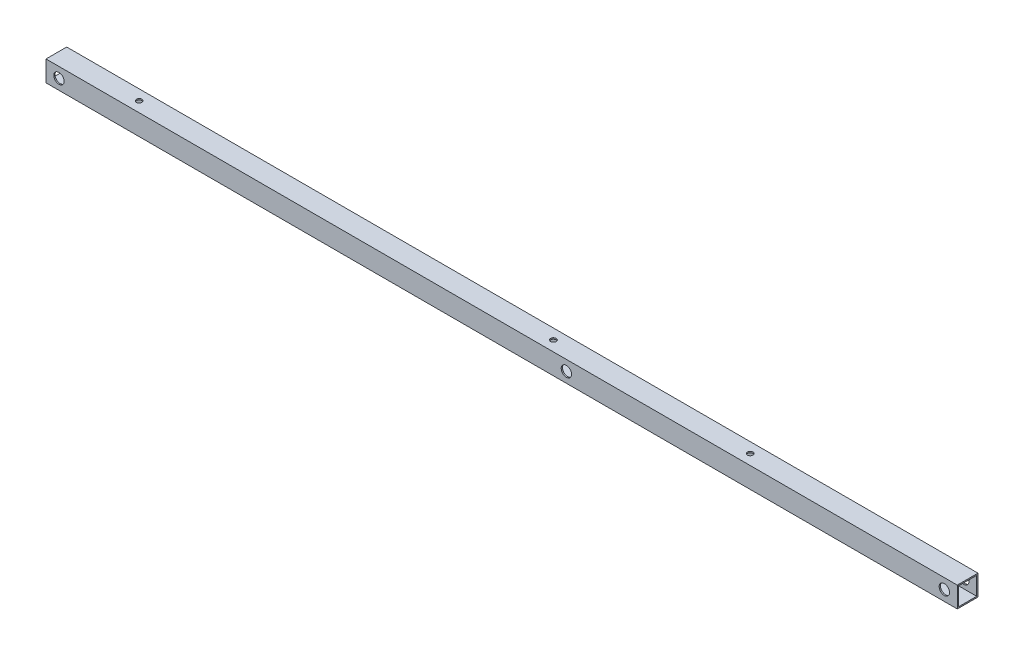
ISO-10303-21;
HEADER;
FILE_DESCRIPTION(('STEP AP214'),'2;1');
FILE_NAME('part.step','',(''),(''),'','','');
FILE_SCHEMA(('AUTOMOTIVE_DESIGN { 1 0 10303 214 1 1 1 1 }'));
ENDSEC;
DATA;
#1=APPLICATION_CONTEXT('core data for automotive mechanical design processes');
#2=APPLICATION_PROTOCOL_DEFINITION('international standard','automotive_design',2000,#1);
#3=PRODUCT_CONTEXT('',#1,'mechanical');
#4=PRODUCT('Part','Part','',(#3));
#5=PRODUCT_RELATED_PRODUCT_CATEGORY('part','',(#4));
#6=PRODUCT_DEFINITION_FORMATION('','',#4);
#7=PRODUCT_DEFINITION_CONTEXT('part definition',#1,'design');
#8=PRODUCT_DEFINITION('design','',#6,#7);
#9=PRODUCT_DEFINITION_SHAPE('','',#8);
#10=(LENGTH_UNIT() NAMED_UNIT(*) SI_UNIT(.MILLI.,.METRE.));
#11=(NAMED_UNIT(*) PLANE_ANGLE_UNIT() SI_UNIT($,.RADIAN.));
#12=(NAMED_UNIT(*) SI_UNIT($,.STERADIAN.) SOLID_ANGLE_UNIT());
#13=UNCERTAINTY_MEASURE_WITH_UNIT(LENGTH_MEASURE(1.E-05),#10,'distance_accuracy_value','');
#14=(GEOMETRIC_REPRESENTATION_CONTEXT(3) GLOBAL_UNCERTAINTY_ASSIGNED_CONTEXT((#13)) GLOBAL_UNIT_ASSIGNED_CONTEXT((#10,
#11,#12)) REPRESENTATION_CONTEXT('',''));
#15=CARTESIAN_POINT('',(0.,0.,0.));
#16=DIRECTION('',(0.,0.,1.));
#17=DIRECTION('',(1.,0.,0.));
#18=AXIS2_PLACEMENT_3D('',#15,#16,#17);
#19=CARTESIAN_POINT('',(558.8,12.7,12.7));
#20=DIRECTION('',(0.,-1.,0.));
#21=DIRECTION('',(0.,0.,-1.));
#22=AXIS2_PLACEMENT_3D('',#19,#20,#21);
#23=PLANE('',#22);
#24=CARTESIAN_POINT('',(-457.2,12.7,0.));
#25=DIRECTION('',(0.,1.,0.));
#26=DIRECTION('',(0.,0.,1.));
#27=AXIS2_PLACEMENT_3D('',#24,#25,#26);
#28=CIRCLE('',#27,3.3782);
#29=CARTESIAN_POINT('',(-457.2,12.7,3.3782));
#30=VERTEX_POINT('',#29);
#31=EDGE_CURVE('E361',#30,#30,#28,.T.);
#32=ORIENTED_EDGE('',*,*,#31,.F.);
#33=EDGE_LOOP('',(#32));
#34=FACE_BOUND('',#33,.T.);
#35=CARTESIAN_POINT('',(292.1,12.7,0.));
#36=DIRECTION('',(0.,1.,0.));
#37=DIRECTION('',(0.,0.,1.));
#38=AXIS2_PLACEMENT_3D('',#35,#36,#37);
#39=CIRCLE('',#38,3.3782);
#40=CARTESIAN_POINT('',(292.1,12.7,3.3782));
#41=VERTEX_POINT('',#40);
#42=EDGE_CURVE('E231',#41,#41,#39,.T.);
#43=ORIENTED_EDGE('',*,*,#42,.F.);
#44=EDGE_LOOP('',(#43));
#45=FACE_BOUND('',#44,.T.);
#46=DIRECTION('',(0.,0.,1.));
#47=VECTOR('',#46,1.);
#48=CARTESIAN_POINT('',(-558.8,12.7,12.7));
#49=LINE('',#48,#47);
#50=CARTESIAN_POINT('',(-558.8,12.7,-12.7));
#51=VERTEX_POINT('',#50);
#52=CARTESIAN_POINT('',(-558.8,12.7,12.7));
#53=VERTEX_POINT('',#52);
#54=EDGE_CURVE('E177',#51,#53,#49,.T.);
#55=ORIENTED_EDGE('',*,*,#54,.T.);
#56=DIRECTION('',(-1.,0.,0.));
#57=VECTOR('',#56,1.);
#58=CARTESIAN_POINT('',(558.8,12.7,12.7));
#59=LINE('',#58,#57);
#60=CARTESIAN_POINT('',(558.8,12.7,12.7));
#61=VERTEX_POINT('',#60);
#62=EDGE_CURVE('E68',#61,#53,#59,.T.);
#63=ORIENTED_EDGE('',*,*,#62,.F.);
#64=DIRECTION('',(0.,0.,1.));
#65=VECTOR('',#64,1.);
#66=CARTESIAN_POINT('',(558.8,12.7,12.7));
#67=LINE('',#66,#65);
#68=CARTESIAN_POINT('',(558.8,12.7,-12.7));
#69=VERTEX_POINT('',#68);
#70=EDGE_CURVE('E167',#69,#61,#67,.T.);
#71=ORIENTED_EDGE('',*,*,#70,.F.);
#72=DIRECTION('',(-1.,0.,0.));
#73=VECTOR('',#72,1.);
#74=CARTESIAN_POINT('',(558.8,12.7,-12.7));
#75=LINE('',#74,#73);
#76=EDGE_CURVE('E12',#69,#51,#75,.T.);
#77=ORIENTED_EDGE('',*,*,#76,.T.);
#78=EDGE_LOOP('',(#55,#63,#71,#77));
#79=FACE_BOUND('',#78,.T.);
#80=CARTESIAN_POINT('',(50.8,12.7,0.));
#81=DIRECTION('',(0.,1.,0.));
#82=DIRECTION('',(0.,0.,1.));
#83=AXIS2_PLACEMENT_3D('',#80,#81,#82);
#84=CIRCLE('',#83,3.3782);
#85=CARTESIAN_POINT('',(50.8,12.7,3.3782));
#86=VERTEX_POINT('',#85);
#87=EDGE_CURVE('E213',#86,#86,#84,.T.);
#88=ORIENTED_EDGE('',*,*,#87,.F.);
#89=EDGE_LOOP('',(#88));
#90=FACE_BOUND('',#89,.T.);
#91=ADVANCED_FACE('F59',(#34,#45,#79,#90),#23,.F.);
#92=CARTESIAN_POINT('',(558.8,0.,0.));
#93=DIRECTION('',(1.,0.,0.));
#94=DIRECTION('',(0.,0.,-1.));
#95=AXIS2_PLACEMENT_3D('',#92,#93,#94);
#96=PLANE('',#95);
#97=DIRECTION('',(0.,1.,0.));
#98=VECTOR('',#97,1.);
#99=CARTESIAN_POINT('',(558.8,-12.7,-12.7));
#100=LINE('',#99,#98);
#101=CARTESIAN_POINT('',(558.8,-12.7,-12.7));
#102=VERTEX_POINT('',#101);
#103=EDGE_CURVE('E164',#102,#69,#100,.T.);
#104=ORIENTED_EDGE('',*,*,#103,.T.);
#105=ORIENTED_EDGE('',*,*,#70,.T.);
#106=DIRECTION('',(0.,-1.,0.));
#107=VECTOR('',#106,1.);
#108=CARTESIAN_POINT('',(558.8,-12.7,12.7));
#109=LINE('',#108,#107);
#110=CARTESIAN_POINT('',(558.8,-12.7,12.7));
#111=VERTEX_POINT('',#110);
#112=EDGE_CURVE('E170',#61,#111,#109,.T.);
#113=ORIENTED_EDGE('',*,*,#112,.T.);
#114=DIRECTION('',(0.,0.,-1.));
#115=VECTOR('',#114,1.);
#116=CARTESIAN_POINT('',(558.8,-12.7,12.7));
#117=LINE('',#116,#115);
#118=EDGE_CURVE('E172',#111,#102,#117,.T.);
#119=ORIENTED_EDGE('',*,*,#118,.T.);
#120=EDGE_LOOP('',(#104,#105,#113,#119));
#121=FACE_BOUND('',#120,.T.);
#122=DIRECTION('',(0.,0.,1.));
#123=VECTOR('',#122,1.);
#124=CARTESIAN_POINT('',(558.8,11.1125,0.));
#125=LINE('',#124,#123);
#126=CARTESIAN_POINT('',(558.8,11.1125,-11.1125));
#127=VERTEX_POINT('',#126);
#128=CARTESIAN_POINT('',(558.8,11.1125,11.1125));
#129=VERTEX_POINT('',#128);
#130=EDGE_CURVE('E133',#127,#129,#125,.T.);
#131=ORIENTED_EDGE('',*,*,#130,.F.);
#132=DIRECTION('',(0.,1.,0.));
#133=VECTOR('',#132,1.);
#134=CARTESIAN_POINT('',(558.8,0.,-11.1125));
#135=LINE('',#134,#133);
#136=CARTESIAN_POINT('',(558.8,-11.1125,-11.1125));
#137=VERTEX_POINT('',#136);
#138=EDGE_CURVE('E125',#137,#127,#135,.T.);
#139=ORIENTED_EDGE('',*,*,#138,.F.);
#140=DIRECTION('',(0.,0.,-1.));
#141=VECTOR('',#140,1.);
#142=CARTESIAN_POINT('',(558.8,-11.1125,0.));
#143=LINE('',#142,#141);
#144=CARTESIAN_POINT('',(558.8,-11.1125,11.1125));
#145=VERTEX_POINT('',#144);
#146=EDGE_CURVE('E148',#145,#137,#143,.T.);
#147=ORIENTED_EDGE('',*,*,#146,.F.);
#148=DIRECTION('',(0.,-1.,0.));
#149=VECTOR('',#148,1.);
#150=CARTESIAN_POINT('',(558.8,0.,11.1125));
#151=LINE('',#150,#149);
#152=EDGE_CURVE('E146',#129,#145,#151,.T.);
#153=ORIENTED_EDGE('',*,*,#152,.F.);
#154=EDGE_LOOP('',(#131,#139,#147,#153));
#155=FACE_BOUND('',#154,.T.);
#156=ADVANCED_FACE('F145',(#121,#155),#96,.T.);
#157=CARTESIAN_POINT('',(-558.8,0.,0.));
#158=DIRECTION('',(1.,0.,0.));
#159=DIRECTION('',(0.,0.,-1.));
#160=AXIS2_PLACEMENT_3D('',#157,#158,#159);
#161=PLANE('',#160);
#162=DIRECTION('',(0.,1.,0.));
#163=VECTOR('',#162,1.);
#164=CARTESIAN_POINT('',(-558.8,-12.7,-12.7));
#165=LINE('',#164,#163);
#166=CARTESIAN_POINT('',(-558.8,-12.7,-12.7));
#167=VERTEX_POINT('',#166);
#168=EDGE_CURVE('E141',#167,#51,#165,.T.);
#169=ORIENTED_EDGE('',*,*,#168,.F.);
#170=DIRECTION('',(0.,0.,-1.));
#171=VECTOR('',#170,1.);
#172=CARTESIAN_POINT('',(-558.8,-12.7,12.7));
#173=LINE('',#172,#171);
#174=CARTESIAN_POINT('',(-558.8,-12.7,12.7));
#175=VERTEX_POINT('',#174);
#176=EDGE_CURVE('E168',#175,#167,#173,.T.);
#177=ORIENTED_EDGE('',*,*,#176,.F.);
#178=DIRECTION('',(0.,-1.,0.));
#179=VECTOR('',#178,1.);
#180=CARTESIAN_POINT('',(-558.8,-12.7,12.7));
#181=LINE('',#180,#179);
#182=EDGE_CURVE('E179',#53,#175,#181,.T.);
#183=ORIENTED_EDGE('',*,*,#182,.F.);
#184=ORIENTED_EDGE('',*,*,#54,.F.);
#185=EDGE_LOOP('',(#169,#177,#183,#184));
#186=FACE_BOUND('',#185,.T.);
#187=DIRECTION('',(0.,1.,0.));
#188=VECTOR('',#187,1.);
#189=CARTESIAN_POINT('',(-558.8,0.,-11.1125));
#190=LINE('',#189,#188);
#191=CARTESIAN_POINT('',(-558.8,-11.1125,-11.1125));
#192=VERTEX_POINT('',#191);
#193=CARTESIAN_POINT('',(-558.8,11.1125,-11.1125));
#194=VERTEX_POINT('',#193);
#195=EDGE_CURVE('E83',#192,#194,#190,.T.);
#196=ORIENTED_EDGE('',*,*,#195,.T.);
#197=DIRECTION('',(0.,0.,1.));
#198=VECTOR('',#197,1.);
#199=CARTESIAN_POINT('',(-558.8,11.1125,0.));
#200=LINE('',#199,#198);
#201=CARTESIAN_POINT('',(-558.8,11.1125,11.1125));
#202=VERTEX_POINT('',#201);
#203=EDGE_CURVE('E140',#194,#202,#200,.T.);
#204=ORIENTED_EDGE('',*,*,#203,.T.);
#205=DIRECTION('',(0.,-1.,0.));
#206=VECTOR('',#205,1.);
#207=CARTESIAN_POINT('',(-558.8,0.,11.1125));
#208=LINE('',#207,#206);
#209=CARTESIAN_POINT('',(-558.8,-11.1125,11.1125));
#210=VERTEX_POINT('',#209);
#211=EDGE_CURVE('E156',#202,#210,#208,.T.);
#212=ORIENTED_EDGE('',*,*,#211,.T.);
#213=DIRECTION('',(0.,0.,-1.));
#214=VECTOR('',#213,1.);
#215=CARTESIAN_POINT('',(-558.8,-11.1125,0.));
#216=LINE('',#215,#214);
#217=EDGE_CURVE('E134',#210,#192,#216,.T.);
#218=ORIENTED_EDGE('',*,*,#217,.T.);
#219=EDGE_LOOP('',(#196,#204,#212,#218));
#220=FACE_BOUND('',#219,.T.);
#221=ADVANCED_FACE('F198',(#186,#220),#161,.F.);
#222=CARTESIAN_POINT('',(558.8,-12.7,-12.7));
#223=DIRECTION('',(0.,0.,1.));
#224=DIRECTION('',(1.,0.,0.));
#225=AXIS2_PLACEMENT_3D('',#222,#223,#224);
#226=PLANE('',#225);
#227=CARTESIAN_POINT('',(-542.925,0.,-12.7));
#228=DIRECTION('',(0.,0.,1.));
#229=DIRECTION('',(1.,0.,0.));
#230=AXIS2_PLACEMENT_3D('',#227,#228,#229);
#231=CIRCLE('',#230,6.34999999999997);
#232=CARTESIAN_POINT('',(-536.575,0.,-12.7));
#233=VERTEX_POINT('',#232);
#234=EDGE_CURVE('E246',#233,#233,#231,.T.);
#235=ORIENTED_EDGE('',*,*,#234,.T.);
#236=EDGE_LOOP('',(#235));
#237=FACE_BOUND('',#236,.T.);
#238=CARTESIAN_POINT('',(542.925,0.,-12.7));
#239=DIRECTION('',(0.,0.,1.));
#240=DIRECTION('',(1.,0.,0.));
#241=AXIS2_PLACEMENT_3D('',#238,#239,#240);
#242=CIRCLE('',#241,6.34999999999997);
#243=CARTESIAN_POINT('',(549.275,0.,-12.7));
#244=VERTEX_POINT('',#243);
#245=EDGE_CURVE('E255',#244,#244,#242,.T.);
#246=ORIENTED_EDGE('',*,*,#245,.T.);
#247=EDGE_LOOP('',(#246));
#248=FACE_BOUND('',#247,.T.);
#249=CARTESIAN_POINT('',(79.375,0.,-12.7));
#250=DIRECTION('',(0.,0.,1.));
#251=DIRECTION('',(1.,0.,0.));
#252=AXIS2_PLACEMENT_3D('',#249,#250,#251);
#253=CIRCLE('',#252,6.34999999999999);
#254=CARTESIAN_POINT('',(85.725,0.,-12.7));
#255=VERTEX_POINT('',#254);
#256=EDGE_CURVE('E267',#255,#255,#253,.T.);
#257=ORIENTED_EDGE('',*,*,#256,.T.);
#258=EDGE_LOOP('',(#257));
#259=FACE_BOUND('',#258,.T.);
#260=ORIENTED_EDGE('',*,*,#168,.T.);
#261=ORIENTED_EDGE('',*,*,#76,.F.);
#262=ORIENTED_EDGE('',*,*,#103,.F.);
#263=DIRECTION('',(-1.,0.,0.));
#264=VECTOR('',#263,1.);
#265=CARTESIAN_POINT('',(558.8,-12.7,-12.7));
#266=LINE('',#265,#264);
#267=EDGE_CURVE('E174',#102,#167,#266,.T.);
#268=ORIENTED_EDGE('',*,*,#267,.T.);
#269=EDGE_LOOP('',(#260,#261,#262,#268));
#270=FACE_BOUND('',#269,.T.);
#271=ADVANCED_FACE('F61',(#237,#248,#259,#270),#226,.F.);
#272=CARTESIAN_POINT('',(558.8,-12.7,12.7));
#273=DIRECTION('',(0.,0.,-1.));
#274=DIRECTION('',(-1.,0.,0.));
#275=AXIS2_PLACEMENT_3D('',#272,#273,#274);
#276=PLANE('',#275);
#277=CARTESIAN_POINT('',(-542.925,0.,12.7));
#278=DIRECTION('',(0.,0.,1.));
#279=DIRECTION('',(1.,0.,0.));
#280=AXIS2_PLACEMENT_3D('',#277,#278,#279);
#281=CIRCLE('',#280,6.34999999999997);
#282=CARTESIAN_POINT('',(-536.575,0.,12.7));
#283=VERTEX_POINT('',#282);
#284=EDGE_CURVE('E243',#283,#283,#281,.T.);
#285=ORIENTED_EDGE('',*,*,#284,.F.);
#286=EDGE_LOOP('',(#285));
#287=FACE_BOUND('',#286,.T.);
#288=CARTESIAN_POINT('',(542.925,0.,12.7));
#289=DIRECTION('',(0.,0.,1.));
#290=DIRECTION('',(1.,0.,0.));
#291=AXIS2_PLACEMENT_3D('',#288,#289,#290);
#292=CIRCLE('',#291,6.34999999999997);
#293=CARTESIAN_POINT('',(549.275,0.,12.7));
#294=VERTEX_POINT('',#293);
#295=EDGE_CURVE('E252',#294,#294,#292,.T.);
#296=ORIENTED_EDGE('',*,*,#295,.F.);
#297=EDGE_LOOP('',(#296));
#298=FACE_BOUND('',#297,.T.);
#299=CARTESIAN_POINT('',(79.375,0.,12.7));
#300=DIRECTION('',(0.,0.,1.));
#301=DIRECTION('',(1.,0.,0.));
#302=AXIS2_PLACEMENT_3D('',#299,#300,#301);
#303=CIRCLE('',#302,6.34999999999999);
#304=CARTESIAN_POINT('',(85.725,0.,12.7));
#305=VERTEX_POINT('',#304);
#306=EDGE_CURVE('E264',#305,#305,#303,.T.);
#307=ORIENTED_EDGE('',*,*,#306,.F.);
#308=EDGE_LOOP('',(#307));
#309=FACE_BOUND('',#308,.T.);
#310=ORIENTED_EDGE('',*,*,#182,.T.);
#311=DIRECTION('',(-1.,0.,0.));
#312=VECTOR('',#311,1.);
#313=CARTESIAN_POINT('',(558.8,-12.7,12.7));
#314=LINE('',#313,#312);
#315=EDGE_CURVE('E184',#111,#175,#314,.T.);
#316=ORIENTED_EDGE('',*,*,#315,.F.);
#317=ORIENTED_EDGE('',*,*,#112,.F.);
#318=ORIENTED_EDGE('',*,*,#62,.T.);
#319=EDGE_LOOP('',(#310,#316,#317,#318));
#320=FACE_BOUND('',#319,.T.);
#321=ADVANCED_FACE('F192',(#287,#298,#309,#320),#276,.F.);
#322=CARTESIAN_POINT('',(558.8,-12.7,12.7));
#323=DIRECTION('',(0.,1.,0.));
#324=DIRECTION('',(0.,0.,1.));
#325=AXIS2_PLACEMENT_3D('',#322,#323,#324);
#326=PLANE('',#325);
#327=CARTESIAN_POINT('',(-457.2,-12.7,0.));
#328=DIRECTION('',(0.,1.,0.));
#329=DIRECTION('',(0.,0.,1.));
#330=AXIS2_PLACEMENT_3D('',#327,#328,#329);
#331=CIRCLE('',#330,3.3782);
#332=CARTESIAN_POINT('',(-457.2,-12.7,3.3782));
#333=VERTEX_POINT('',#332);
#334=EDGE_CURVE('E362',#333,#333,#331,.T.);
#335=ORIENTED_EDGE('',*,*,#334,.T.);
#336=EDGE_LOOP('',(#335));
#337=FACE_BOUND('',#336,.T.);
#338=CARTESIAN_POINT('',(50.8,-12.7,0.));
#339=DIRECTION('',(0.,1.,0.));
#340=DIRECTION('',(0.,0.,1.));
#341=AXIS2_PLACEMENT_3D('',#338,#339,#340);
#342=CIRCLE('',#341,3.37819999999999);
#343=CARTESIAN_POINT('',(50.8,-12.7,3.37819999999999));
#344=VERTEX_POINT('',#343);
#345=EDGE_CURVE('E215',#344,#344,#342,.T.);
#346=ORIENTED_EDGE('',*,*,#345,.T.);
#347=EDGE_LOOP('',(#346));
#348=FACE_BOUND('',#347,.T.);
#349=CARTESIAN_POINT('',(292.1,-12.7,0.));
#350=DIRECTION('',(0.,1.,0.));
#351=DIRECTION('',(0.,0.,1.));
#352=AXIS2_PLACEMENT_3D('',#349,#350,#351);
#353=CIRCLE('',#352,3.3782);
#354=CARTESIAN_POINT('',(292.1,-12.7,3.3782));
#355=VERTEX_POINT('',#354);
#356=EDGE_CURVE('E234',#355,#355,#353,.T.);
#357=ORIENTED_EDGE('',*,*,#356,.T.);
#358=EDGE_LOOP('',(#357));
#359=FACE_BOUND('',#358,.T.);
#360=ORIENTED_EDGE('',*,*,#176,.T.);
#361=ORIENTED_EDGE('',*,*,#267,.F.);
#362=ORIENTED_EDGE('',*,*,#118,.F.);
#363=ORIENTED_EDGE('',*,*,#315,.T.);
#364=EDGE_LOOP('',(#360,#361,#362,#363));
#365=FACE_BOUND('',#364,.T.);
#366=ADVANCED_FACE('F202',(#337,#348,#359,#365),#326,.F.);
#367=CARTESIAN_POINT('',(558.8,0.,-11.1125));
#368=DIRECTION('',(0.,0.,1.));
#369=DIRECTION('',(1.,0.,0.));
#370=AXIS2_PLACEMENT_3D('',#367,#368,#369);
#371=PLANE('',#370);
#372=CARTESIAN_POINT('',(-542.925,0.,-11.1125));
#373=DIRECTION('',(0.,0.,1.));
#374=DIRECTION('',(1.,0.,0.));
#375=AXIS2_PLACEMENT_3D('',#372,#373,#374);
#376=CIRCLE('',#375,6.34999999999997);
#377=CARTESIAN_POINT('',(-536.575,0.,-11.1125));
#378=VERTEX_POINT('',#377);
#379=EDGE_CURVE('E249',#378,#378,#376,.T.);
#380=ORIENTED_EDGE('',*,*,#379,.F.);
#381=EDGE_LOOP('',(#380));
#382=FACE_BOUND('',#381,.T.);
#383=CARTESIAN_POINT('',(542.925,0.,-11.1125));
#384=DIRECTION('',(0.,0.,1.));
#385=DIRECTION('',(1.,0.,0.));
#386=AXIS2_PLACEMENT_3D('',#383,#384,#385);
#387=CIRCLE('',#386,6.34999999999997);
#388=CARTESIAN_POINT('',(549.275,0.,-11.1125));
#389=VERTEX_POINT('',#388);
#390=EDGE_CURVE('E258',#389,#389,#387,.T.);
#391=ORIENTED_EDGE('',*,*,#390,.F.);
#392=EDGE_LOOP('',(#391));
#393=FACE_BOUND('',#392,.T.);
#394=CARTESIAN_POINT('',(79.375,0.,-11.1125));
#395=DIRECTION('',(0.,0.,1.));
#396=DIRECTION('',(1.,0.,0.));
#397=AXIS2_PLACEMENT_3D('',#394,#395,#396);
#398=CIRCLE('',#397,6.34999999999999);
#399=CARTESIAN_POINT('',(85.725,0.,-11.1125));
#400=VERTEX_POINT('',#399);
#401=EDGE_CURVE('E270',#400,#400,#398,.T.);
#402=ORIENTED_EDGE('',*,*,#401,.F.);
#403=EDGE_LOOP('',(#402));
#404=FACE_BOUND('',#403,.T.);
#405=ORIENTED_EDGE('',*,*,#195,.F.);
#406=DIRECTION('',(-1.,0.,0.));
#407=VECTOR('',#406,1.);
#408=CARTESIAN_POINT('',(558.8,-11.1125,-11.1125));
#409=LINE('',#408,#407);
#410=EDGE_CURVE('E129',#137,#192,#409,.T.);
#411=ORIENTED_EDGE('',*,*,#410,.F.);
#412=ORIENTED_EDGE('',*,*,#138,.T.);
#413=DIRECTION('',(-1.,0.,0.));
#414=VECTOR('',#413,1.);
#415=CARTESIAN_POINT('',(558.8,11.1125,-11.1125));
#416=LINE('',#415,#414);
#417=EDGE_CURVE('E128',#127,#194,#416,.T.);
#418=ORIENTED_EDGE('',*,*,#417,.T.);
#419=EDGE_LOOP('',(#405,#411,#412,#418));
#420=FACE_BOUND('',#419,.T.);
#421=ADVANCED_FACE('F127',(#382,#393,#404,#420),#371,.T.);
#422=CARTESIAN_POINT('',(558.8,11.1125,0.));
#423=DIRECTION('',(0.,-1.,0.));
#424=DIRECTION('',(0.,0.,-1.));
#425=AXIS2_PLACEMENT_3D('',#422,#423,#424);
#426=PLANE('',#425);
#427=CARTESIAN_POINT('',(-457.2,11.1125,0.));
#428=DIRECTION('',(0.,-1.,0.));
#429=DIRECTION('',(0.,0.,-1.));
#430=AXIS2_PLACEMENT_3D('',#427,#428,#429);
#431=CIRCLE('',#430,3.3782);
#432=CARTESIAN_POINT('',(-457.2,11.1125,-3.3782));
#433=VERTEX_POINT('',#432);
#434=EDGE_CURVE('E222',#433,#433,#431,.T.);
#435=ORIENTED_EDGE('',*,*,#434,.F.);
#436=EDGE_LOOP('',(#435));
#437=FACE_BOUND('',#436,.T.);
#438=CARTESIAN_POINT('',(50.8,11.1125,0.));
#439=DIRECTION('',(0.,-1.,0.));
#440=DIRECTION('',(0.,0.,-1.));
#441=AXIS2_PLACEMENT_3D('',#438,#439,#440);
#442=CIRCLE('',#441,3.37819999999999);
#443=CARTESIAN_POINT('',(50.8,11.1125,-3.3782));
#444=VERTEX_POINT('',#443);
#445=EDGE_CURVE('E219',#444,#444,#442,.T.);
#446=ORIENTED_EDGE('',*,*,#445,.F.);
#447=EDGE_LOOP('',(#446));
#448=FACE_BOUND('',#447,.T.);
#449=CARTESIAN_POINT('',(292.1,11.1125,0.));
#450=DIRECTION('',(0.,-1.,0.));
#451=DIRECTION('',(0.,0.,-1.));
#452=AXIS2_PLACEMENT_3D('',#449,#450,#451);
#453=CIRCLE('',#452,3.3782);
#454=CARTESIAN_POINT('',(292.1,11.1125,-3.3782));
#455=VERTEX_POINT('',#454);
#456=EDGE_CURVE('E240',#455,#455,#453,.T.);
#457=ORIENTED_EDGE('',*,*,#456,.F.);
#458=EDGE_LOOP('',(#457));
#459=FACE_BOUND('',#458,.T.);
#460=ORIENTED_EDGE('',*,*,#203,.F.);
#461=ORIENTED_EDGE('',*,*,#417,.F.);
#462=ORIENTED_EDGE('',*,*,#130,.T.);
#463=DIRECTION('',(-1.,0.,0.));
#464=VECTOR('',#463,1.);
#465=CARTESIAN_POINT('',(558.8,11.1125,11.1125));
#466=LINE('',#465,#464);
#467=EDGE_CURVE('E142',#129,#202,#466,.T.);
#468=ORIENTED_EDGE('',*,*,#467,.T.);
#469=EDGE_LOOP('',(#460,#461,#462,#468));
#470=FACE_BOUND('',#469,.T.);
#471=ADVANCED_FACE('F137',(#437,#448,#459,#470),#426,.T.);
#472=CARTESIAN_POINT('',(558.8,0.,11.1125));
#473=DIRECTION('',(0.,0.,-1.));
#474=DIRECTION('',(-1.,0.,0.));
#475=AXIS2_PLACEMENT_3D('',#472,#473,#474);
#476=PLANE('',#475);
#477=CARTESIAN_POINT('',(-542.925,0.,11.1125));
#478=DIRECTION('',(0.,0.,-1.));
#479=DIRECTION('',(-1.,0.,0.));
#480=AXIS2_PLACEMENT_3D('',#477,#478,#479);
#481=CIRCLE('',#480,6.34999999999997);
#482=CARTESIAN_POINT('',(-549.275,0.,11.1125));
#483=VERTEX_POINT('',#482);
#484=EDGE_CURVE('E63',#483,#483,#481,.T.);
#485=ORIENTED_EDGE('',*,*,#484,.F.);
#486=EDGE_LOOP('',(#485));
#487=FACE_BOUND('',#486,.T.);
#488=CARTESIAN_POINT('',(542.925,0.,11.1125));
#489=DIRECTION('',(0.,0.,-1.));
#490=DIRECTION('',(-1.,0.,0.));
#491=AXIS2_PLACEMENT_3D('',#488,#489,#490);
#492=CIRCLE('',#491,6.34999999999997);
#493=CARTESIAN_POINT('',(536.575,0.,11.1125));
#494=VERTEX_POINT('',#493);
#495=EDGE_CURVE('E261',#494,#494,#492,.T.);
#496=ORIENTED_EDGE('',*,*,#495,.F.);
#497=EDGE_LOOP('',(#496));
#498=FACE_BOUND('',#497,.T.);
#499=CARTESIAN_POINT('',(79.375,0.,11.1125));
#500=DIRECTION('',(0.,0.,-1.));
#501=DIRECTION('',(-1.,0.,0.));
#502=AXIS2_PLACEMENT_3D('',#499,#500,#501);
#503=CIRCLE('',#502,6.34999999999999);
#504=CARTESIAN_POINT('',(73.025,0.,11.1125));
#505=VERTEX_POINT('',#504);
#506=EDGE_CURVE('E154',#505,#505,#503,.T.);
#507=ORIENTED_EDGE('',*,*,#506,.F.);
#508=EDGE_LOOP('',(#507));
#509=FACE_BOUND('',#508,.T.);
#510=ORIENTED_EDGE('',*,*,#211,.F.);
#511=ORIENTED_EDGE('',*,*,#467,.F.);
#512=ORIENTED_EDGE('',*,*,#152,.T.);
#513=DIRECTION('',(-1.,0.,0.));
#514=VECTOR('',#513,1.);
#515=CARTESIAN_POINT('',(558.8,-11.1125,11.1125));
#516=LINE('',#515,#514);
#517=EDGE_CURVE('E75',#145,#210,#516,.T.);
#518=ORIENTED_EDGE('',*,*,#517,.T.);
#519=EDGE_LOOP('',(#510,#511,#512,#518));
#520=FACE_BOUND('',#519,.T.);
#521=ADVANCED_FACE('F278',(#487,#498,#509,#520),#476,.T.);
#522=CARTESIAN_POINT('',(558.8,-11.1125,0.));
#523=DIRECTION('',(0.,1.,0.));
#524=DIRECTION('',(0.,0.,1.));
#525=AXIS2_PLACEMENT_3D('',#522,#523,#524);
#526=PLANE('',#525);
#527=CARTESIAN_POINT('',(-457.2,-11.1125,0.));
#528=DIRECTION('',(0.,1.,0.));
#529=DIRECTION('',(0.,0.,1.));
#530=AXIS2_PLACEMENT_3D('',#527,#528,#529);
#531=CIRCLE('',#530,3.3782);
#532=CARTESIAN_POINT('',(-457.2,-11.1125,3.3782));
#533=VERTEX_POINT('',#532);
#534=EDGE_CURVE('E216',#533,#533,#531,.T.);
#535=ORIENTED_EDGE('',*,*,#534,.F.);
#536=EDGE_LOOP('',(#535));
#537=FACE_BOUND('',#536,.T.);
#538=CARTESIAN_POINT('',(50.8,-11.1125,0.));
#539=DIRECTION('',(0.,1.,0.));
#540=DIRECTION('',(0.,0.,1.));
#541=AXIS2_PLACEMENT_3D('',#538,#539,#540);
#542=CIRCLE('',#541,3.37819999999999);
#543=CARTESIAN_POINT('',(50.8,-11.1125,3.3782));
#544=VERTEX_POINT('',#543);
#545=EDGE_CURVE('E228',#544,#544,#542,.T.);
#546=ORIENTED_EDGE('',*,*,#545,.F.);
#547=EDGE_LOOP('',(#546));
#548=FACE_BOUND('',#547,.T.);
#549=CARTESIAN_POINT('',(292.1,-11.1125,0.));
#550=DIRECTION('',(0.,1.,0.));
#551=DIRECTION('',(0.,0.,1.));
#552=AXIS2_PLACEMENT_3D('',#549,#550,#551);
#553=CIRCLE('',#552,3.3782);
#554=CARTESIAN_POINT('',(292.1,-11.1125,3.3782));
#555=VERTEX_POINT('',#554);
#556=EDGE_CURVE('E237',#555,#555,#553,.T.);
#557=ORIENTED_EDGE('',*,*,#556,.F.);
#558=EDGE_LOOP('',(#557));
#559=FACE_BOUND('',#558,.T.);
#560=ORIENTED_EDGE('',*,*,#217,.F.);
#561=ORIENTED_EDGE('',*,*,#517,.F.);
#562=ORIENTED_EDGE('',*,*,#146,.T.);
#563=ORIENTED_EDGE('',*,*,#410,.T.);
#564=EDGE_LOOP('',(#560,#561,#562,#563));
#565=FACE_BOUND('',#564,.T.);
#566=ADVANCED_FACE('F281',(#537,#548,#559,#565),#526,.T.);
#567=CARTESIAN_POINT('',(79.375,0.,12.7));
#568=DIRECTION('',(0.,0.,1.));
#569=DIRECTION('',(1.,0.,0.));
#570=AXIS2_PLACEMENT_3D('',#567,#568,#569);
#571=CYLINDRICAL_SURFACE('',#570,6.34999999999999);
#572=ORIENTED_EDGE('',*,*,#506,.T.);
#573=EDGE_LOOP('',(#572));
#574=FACE_BOUND('',#573,.T.);
#575=ORIENTED_EDGE('',*,*,#306,.T.);
#576=EDGE_LOOP('',(#575));
#577=FACE_BOUND('',#576,.T.);
#578=ADVANCED_FACE('F275',(#574,#577),#571,.F.);
#579=ORIENTED_EDGE('',*,*,#401,.T.);
#580=EDGE_LOOP('',(#579));
#581=FACE_BOUND('',#580,.T.);
#582=ORIENTED_EDGE('',*,*,#256,.F.);
#583=EDGE_LOOP('',(#582));
#584=FACE_BOUND('',#583,.T.);
#585=ADVANCED_FACE('F291',(#581,#584),#571,.F.);
#586=CARTESIAN_POINT('',(542.925,0.,12.7));
#587=DIRECTION('',(0.,0.,1.));
#588=DIRECTION('',(1.,0.,0.));
#589=AXIS2_PLACEMENT_3D('',#586,#587,#588);
#590=CYLINDRICAL_SURFACE('',#589,6.34999999999997);
#591=ORIENTED_EDGE('',*,*,#495,.T.);
#592=EDGE_LOOP('',(#591));
#593=FACE_BOUND('',#592,.T.);
#594=ORIENTED_EDGE('',*,*,#295,.T.);
#595=EDGE_LOOP('',(#594));
#596=FACE_BOUND('',#595,.T.);
#597=ADVANCED_FACE('F322',(#593,#596),#590,.F.);
#598=ORIENTED_EDGE('',*,*,#390,.T.);
#599=EDGE_LOOP('',(#598));
#600=FACE_BOUND('',#599,.T.);
#601=ORIENTED_EDGE('',*,*,#245,.F.);
#602=EDGE_LOOP('',(#601));
#603=FACE_BOUND('',#602,.T.);
#604=ADVANCED_FACE('F324',(#600,#603),#590,.F.);
#605=CARTESIAN_POINT('',(-542.925,0.,12.7));
#606=DIRECTION('',(0.,0.,1.));
#607=DIRECTION('',(1.,0.,0.));
#608=AXIS2_PLACEMENT_3D('',#605,#606,#607);
#609=CYLINDRICAL_SURFACE('',#608,6.34999999999997);
#610=ORIENTED_EDGE('',*,*,#484,.T.);
#611=EDGE_LOOP('',(#610));
#612=FACE_BOUND('',#611,.T.);
#613=ORIENTED_EDGE('',*,*,#284,.T.);
#614=EDGE_LOOP('',(#613));
#615=FACE_BOUND('',#614,.T.);
#616=ADVANCED_FACE('F330',(#612,#615),#609,.F.);
#617=ORIENTED_EDGE('',*,*,#379,.T.);
#618=EDGE_LOOP('',(#617));
#619=FACE_BOUND('',#618,.T.);
#620=ORIENTED_EDGE('',*,*,#234,.F.);
#621=EDGE_LOOP('',(#620));
#622=FACE_BOUND('',#621,.T.);
#623=ADVANCED_FACE('F336',(#619,#622),#609,.F.);
#624=CARTESIAN_POINT('',(292.1,12.7,0.));
#625=DIRECTION('',(0.,1.,0.));
#626=DIRECTION('',(0.,0.,1.));
#627=AXIS2_PLACEMENT_3D('',#624,#625,#626);
#628=CYLINDRICAL_SURFACE('',#627,3.3782);
#629=ORIENTED_EDGE('',*,*,#456,.T.);
#630=EDGE_LOOP('',(#629));
#631=FACE_BOUND('',#630,.T.);
#632=ORIENTED_EDGE('',*,*,#42,.T.);
#633=EDGE_LOOP('',(#632));
#634=FACE_BOUND('',#633,.T.);
#635=ADVANCED_FACE('F342',(#631,#634),#628,.F.);
#636=ORIENTED_EDGE('',*,*,#556,.T.);
#637=EDGE_LOOP('',(#636));
#638=FACE_BOUND('',#637,.T.);
#639=ORIENTED_EDGE('',*,*,#356,.F.);
#640=EDGE_LOOP('',(#639));
#641=FACE_BOUND('',#640,.T.);
#642=ADVANCED_FACE('F338',(#638,#641),#628,.F.);
#643=CARTESIAN_POINT('',(50.8,12.7,0.));
#644=DIRECTION('',(0.,1.,0.));
#645=DIRECTION('',(0.,0.,1.));
#646=AXIS2_PLACEMENT_3D('',#643,#644,#645);
#647=CYLINDRICAL_SURFACE('',#646,3.37819999999999);
#648=ORIENTED_EDGE('',*,*,#545,.T.);
#649=EDGE_LOOP('',(#648));
#650=FACE_BOUND('',#649,.T.);
#651=ORIENTED_EDGE('',*,*,#345,.F.);
#652=EDGE_LOOP('',(#651));
#653=FACE_BOUND('',#652,.T.);
#654=ADVANCED_FACE('F341',(#650,#653),#647,.F.);
#655=ORIENTED_EDGE('',*,*,#445,.T.);
#656=EDGE_LOOP('',(#655));
#657=FACE_BOUND('',#656,.T.);
#658=ORIENTED_EDGE('',*,*,#87,.T.);
#659=EDGE_LOOP('',(#658));
#660=FACE_BOUND('',#659,.T.);
#661=ADVANCED_FACE('F344',(#657,#660),#647,.F.);
#662=CARTESIAN_POINT('',(-457.2,12.7,0.));
#663=DIRECTION('',(0.,1.,0.));
#664=DIRECTION('',(0.,0.,1.));
#665=AXIS2_PLACEMENT_3D('',#662,#663,#664);
#666=CYLINDRICAL_SURFACE('',#665,3.3782);
#667=ORIENTED_EDGE('',*,*,#534,.T.);
#668=EDGE_LOOP('',(#667));
#669=FACE_BOUND('',#668,.T.);
#670=ORIENTED_EDGE('',*,*,#334,.F.);
#671=EDGE_LOOP('',(#670));
#672=FACE_BOUND('',#671,.T.);
#673=ADVANCED_FACE('F347',(#669,#672),#666,.F.);
#674=ORIENTED_EDGE('',*,*,#434,.T.);
#675=EDGE_LOOP('',(#674));
#676=FACE_BOUND('',#675,.T.);
#677=ORIENTED_EDGE('',*,*,#31,.T.);
#678=EDGE_LOOP('',(#677));
#679=FACE_BOUND('',#678,.T.);
#680=ADVANCED_FACE('F349',(#676,#679),#666,.F.);
#681=CLOSED_SHELL('',(#91,#156,#221,#271,#321,#366,#421,#471,#521,#566,#578,#585,#597,#604,#616,
#623,#635,#642,#654,#661,#673,#680));
#682=MANIFOLD_SOLID_BREP('B2',#681);
#683=ADVANCED_BREP_SHAPE_REPRESENTATION('',(#18,#682),#14);
#684=SHAPE_DEFINITION_REPRESENTATION(#9,#683);
ENDSEC;
END-ISO-10303-21;
